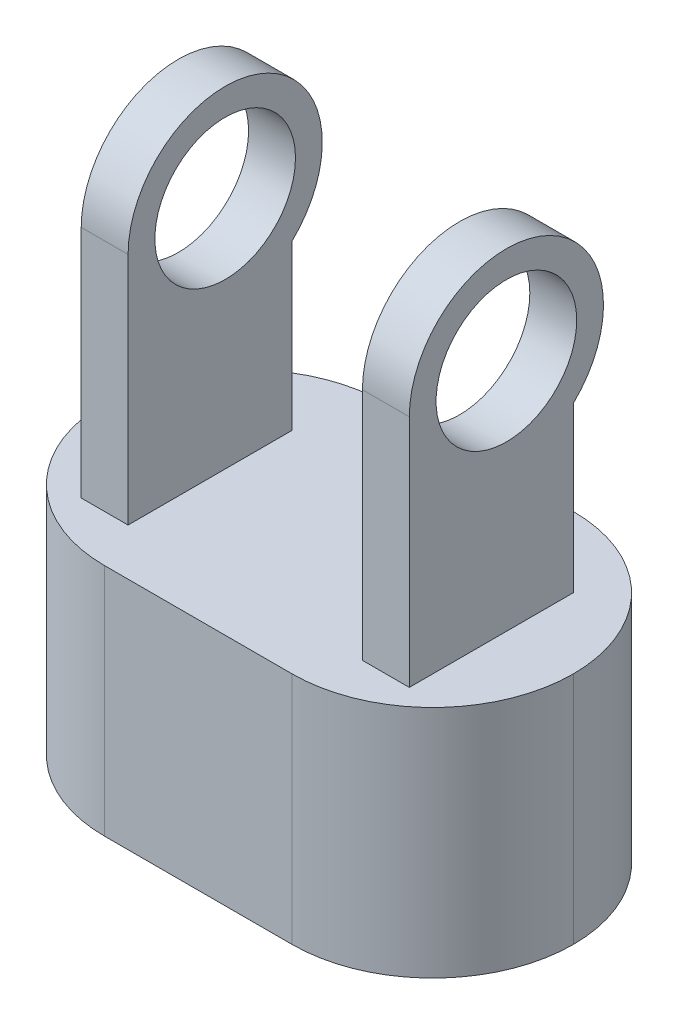
ISO-10303-21;
HEADER;
FILE_DESCRIPTION(('STEP AP214'),'2;1');
FILE_NAME('part.step','',(''),(''),'','','');
FILE_SCHEMA(('AUTOMOTIVE_DESIGN { 1 0 10303 214 1 1 1 1 }'));
ENDSEC;
DATA;
#1=APPLICATION_CONTEXT('core data for automotive mechanical design processes');
#2=APPLICATION_PROTOCOL_DEFINITION('international standard','automotive_design',2000,#1);
#3=PRODUCT_CONTEXT('',#1,'mechanical');
#4=PRODUCT('Part','Part','',(#3));
#5=PRODUCT_RELATED_PRODUCT_CATEGORY('part','',(#4));
#6=PRODUCT_DEFINITION_FORMATION('','',#4);
#7=PRODUCT_DEFINITION_CONTEXT('part definition',#1,'design');
#8=PRODUCT_DEFINITION('design','',#6,#7);
#9=PRODUCT_DEFINITION_SHAPE('','',#8);
#10=(LENGTH_UNIT() NAMED_UNIT(*) SI_UNIT(.MILLI.,.METRE.));
#11=(NAMED_UNIT(*) PLANE_ANGLE_UNIT() SI_UNIT($,.RADIAN.));
#12=(NAMED_UNIT(*) SI_UNIT($,.STERADIAN.) SOLID_ANGLE_UNIT());
#13=UNCERTAINTY_MEASURE_WITH_UNIT(LENGTH_MEASURE(1.E-05),#10,'distance_accuracy_value','');
#14=(GEOMETRIC_REPRESENTATION_CONTEXT(3) GLOBAL_UNCERTAINTY_ASSIGNED_CONTEXT((#13)) GLOBAL_UNIT_ASSIGNED_CONTEXT((#10,
#11,#12)) REPRESENTATION_CONTEXT('',''));
#15=CARTESIAN_POINT('',(0.,0.,0.));
#16=DIRECTION('',(0.,0.,1.));
#17=DIRECTION('',(1.,0.,0.));
#18=AXIS2_PLACEMENT_3D('',#15,#16,#17);
#19=CARTESIAN_POINT('',(-10.,10.,0.));
#20=DIRECTION('',(0.,0.,-1.));
#21=DIRECTION('',(-1.,0.,0.));
#22=AXIS2_PLACEMENT_3D('',#19,#20,#21);
#23=PLANE('',#22);
#24=DIRECTION('',(1.,0.,0.));
#25=VECTOR('',#24,1.);
#26=CARTESIAN_POINT('',(-10.,0.,0.));
#27=LINE('',#26,#25);
#28=CARTESIAN_POINT('',(-4.,0.,0.));
#29=VERTEX_POINT('',#28);
#30=CARTESIAN_POINT('',(4.,0.,0.));
#31=VERTEX_POINT('',#30);
#32=EDGE_CURVE('E281',#29,#31,#27,.T.);
#33=ORIENTED_EDGE('',*,*,#32,.T.);
#34=DIRECTION('',(0.,-1.,0.));
#35=VECTOR('',#34,1.);
#36=CARTESIAN_POINT('',(4.,10.,0.));
#37=LINE('',#36,#35);
#38=CARTESIAN_POINT('',(4.,10.,0.));
#39=VERTEX_POINT('',#38);
#40=EDGE_CURVE('E12',#31,#39,#37,.F.);
#41=ORIENTED_EDGE('',*,*,#40,.T.);
#42=DIRECTION('',(1.,0.,0.));
#43=VECTOR('',#42,1.);
#44=CARTESIAN_POINT('',(-10.,10.,0.));
#45=LINE('',#44,#43);
#46=CARTESIAN_POINT('',(-4.,10.,0.));
#47=VERTEX_POINT('',#46);
#48=EDGE_CURVE('E282',#47,#39,#45,.T.);
#49=ORIENTED_EDGE('',*,*,#48,.F.);
#50=DIRECTION('',(0.,-1.,0.));
#51=VECTOR('',#50,1.);
#52=CARTESIAN_POINT('',(-4.,10.,0.));
#53=LINE('',#52,#51);
#54=EDGE_CURVE('E83',#47,#29,#53,.T.);
#55=ORIENTED_EDGE('',*,*,#54,.T.);
#56=EDGE_LOOP('',(#33,#41,#49,#55));
#57=FACE_BOUND('',#56,.T.);
#58=ADVANCED_FACE('F73',(#57),#23,.F.);
#59=CARTESIAN_POINT('',(10.,10.,-12.));
#60=DIRECTION('',(0.,0.,1.));
#61=DIRECTION('',(1.,0.,0.));
#62=AXIS2_PLACEMENT_3D('',#59,#60,#61);
#63=PLANE('',#62);
#64=DIRECTION('',(-1.,0.,0.));
#65=VECTOR('',#64,1.);
#66=CARTESIAN_POINT('',(10.,0.,-12.));
#67=LINE('',#66,#65);
#68=CARTESIAN_POINT('',(4.,0.,-12.));
#69=VERTEX_POINT('',#68);
#70=CARTESIAN_POINT('',(-4.,0.,-12.));
#71=VERTEX_POINT('',#70);
#72=EDGE_CURVE('E286',#69,#71,#67,.T.);
#73=ORIENTED_EDGE('',*,*,#72,.T.);
#74=DIRECTION('',(0.,-1.,0.));
#75=VECTOR('',#74,1.);
#76=CARTESIAN_POINT('',(-4.,10.,-12.));
#77=LINE('',#76,#75);
#78=CARTESIAN_POINT('',(-4.,10.,-12.));
#79=VERTEX_POINT('',#78);
#80=EDGE_CURVE('E311',#71,#79,#77,.F.);
#81=ORIENTED_EDGE('',*,*,#80,.T.);
#82=DIRECTION('',(-1.,0.,0.));
#83=VECTOR('',#82,1.);
#84=CARTESIAN_POINT('',(10.,10.,-12.));
#85=LINE('',#84,#83);
#86=CARTESIAN_POINT('',(4.,10.,-12.));
#87=VERTEX_POINT('',#86);
#88=EDGE_CURVE('E285',#87,#79,#85,.T.);
#89=ORIENTED_EDGE('',*,*,#88,.F.);
#90=DIRECTION('',(0.,-1.,0.));
#91=VECTOR('',#90,1.);
#92=CARTESIAN_POINT('',(4.,10.,-12.));
#93=LINE('',#92,#91);
#94=EDGE_CURVE('E307',#87,#69,#93,.T.);
#95=ORIENTED_EDGE('',*,*,#94,.T.);
#96=EDGE_LOOP('',(#73,#81,#89,#95));
#97=FACE_BOUND('',#96,.T.);
#98=ADVANCED_FACE('F356',(#97),#63,.F.);
#99=CARTESIAN_POINT('',(0.,10.,0.));
#100=DIRECTION('',(0.,1.,0.));
#101=DIRECTION('',(0.,0.,1.));
#102=AXIS2_PLACEMENT_3D('',#99,#100,#101);
#103=PLANE('',#102);
#104=DIRECTION('',(-1.,0.,0.));
#105=VECTOR('',#104,1.);
#106=CARTESIAN_POINT('',(7.,10.,-9.));
#107=LINE('',#106,#105);
#108=CARTESIAN_POINT('',(7.,10.,-9.));
#109=VERTEX_POINT('',#108);
#110=CARTESIAN_POINT('',(5.,10.,-9.));
#111=VERTEX_POINT('',#110);
#112=EDGE_CURVE('E189',#109,#111,#107,.T.);
#113=ORIENTED_EDGE('',*,*,#112,.F.);
#114=DIRECTION('',(0.,0.,1.));
#115=VECTOR('',#114,1.);
#116=CARTESIAN_POINT('',(7.,10.,-9.));
#117=LINE('',#116,#115);
#118=CARTESIAN_POINT('',(7.,10.,-2.));
#119=VERTEX_POINT('',#118);
#120=EDGE_CURVE('E200',#109,#119,#117,.T.);
#121=ORIENTED_EDGE('',*,*,#120,.T.);
#122=DIRECTION('',(-1.,0.,0.));
#123=VECTOR('',#122,1.);
#124=CARTESIAN_POINT('',(7.,10.,-2.));
#125=LINE('',#124,#123);
#126=CARTESIAN_POINT('',(5.,10.,-2.));
#127=VERTEX_POINT('',#126);
#128=EDGE_CURVE('E208',#119,#127,#125,.T.);
#129=ORIENTED_EDGE('',*,*,#128,.T.);
#130=DIRECTION('',(0.,0.,1.));
#131=VECTOR('',#130,1.);
#132=CARTESIAN_POINT('',(5.,10.,-9.));
#133=LINE('',#132,#131);
#134=EDGE_CURVE('E212',#111,#127,#133,.T.);
#135=ORIENTED_EDGE('',*,*,#134,.F.);
#136=EDGE_LOOP('',(#113,#121,#129,#135));
#137=FACE_BOUND('',#136,.T.);
#138=DIRECTION('',(0.,0.,1.));
#139=VECTOR('',#138,1.);
#140=CARTESIAN_POINT('',(-7.,10.,-9.));
#141=LINE('',#140,#139);
#142=CARTESIAN_POINT('',(-7.,10.,-9.));
#143=VERTEX_POINT('',#142);
#144=CARTESIAN_POINT('',(-7.,10.,-2.));
#145=VERTEX_POINT('',#144);
#146=EDGE_CURVE('E241',#143,#145,#141,.T.);
#147=ORIENTED_EDGE('',*,*,#146,.F.);
#148=DIRECTION('',(1.,0.,0.));
#149=VECTOR('',#148,1.);
#150=CARTESIAN_POINT('',(-7.,10.,-9.));
#151=LINE('',#150,#149);
#152=CARTESIAN_POINT('',(-5.,10.,-9.));
#153=VERTEX_POINT('',#152);
#154=EDGE_CURVE('E255',#143,#153,#151,.T.);
#155=ORIENTED_EDGE('',*,*,#154,.T.);
#156=DIRECTION('',(0.,0.,1.));
#157=VECTOR('',#156,1.);
#158=CARTESIAN_POINT('',(-5.,10.,-9.));
#159=LINE('',#158,#157);
#160=CARTESIAN_POINT('',(-5.,10.,-2.));
#161=VERTEX_POINT('',#160);
#162=EDGE_CURVE('E237',#153,#161,#159,.T.);
#163=ORIENTED_EDGE('',*,*,#162,.T.);
#164=DIRECTION('',(1.,0.,0.));
#165=VECTOR('',#164,1.);
#166=CARTESIAN_POINT('',(-7.,10.,-2.));
#167=LINE('',#166,#165);
#168=EDGE_CURVE('E278',#145,#161,#167,.T.);
#169=ORIENTED_EDGE('',*,*,#168,.F.);
#170=EDGE_LOOP('',(#147,#155,#163,#169));
#171=FACE_BOUND('',#170,.T.);
#172=CARTESIAN_POINT('',(4.,10.,-6.));
#173=DIRECTION('',(0.,1.,0.));
#174=DIRECTION('',(0.,0.,1.));
#175=AXIS2_PLACEMENT_3D('',#172,#173,#174);
#176=CIRCLE('',#175,6.);
#177=CARTESIAN_POINT('',(10.,10.,-6.));
#178=VERTEX_POINT('',#177);
#179=EDGE_CURVE('E91',#39,#178,#176,.T.);
#180=ORIENTED_EDGE('',*,*,#179,.T.);
#181=CARTESIAN_POINT('',(4.,10.,-6.));
#182=DIRECTION('',(0.,1.,0.));
#183=DIRECTION('',(0.,0.,1.));
#184=AXIS2_PLACEMENT_3D('',#181,#182,#183);
#185=CIRCLE('',#184,6.);
#186=EDGE_CURVE('E323',#178,#87,#185,.T.);
#187=ORIENTED_EDGE('',*,*,#186,.T.);
#188=ORIENTED_EDGE('',*,*,#88,.T.);
#189=CARTESIAN_POINT('',(-4.,10.,-6.));
#190=DIRECTION('',(0.,1.,0.));
#191=DIRECTION('',(0.,0.,1.));
#192=AXIS2_PLACEMENT_3D('',#189,#190,#191);
#193=CIRCLE('',#192,6.);
#194=CARTESIAN_POINT('',(-10.,10.,-6.));
#195=VERTEX_POINT('',#194);
#196=EDGE_CURVE('E318',#79,#195,#193,.T.);
#197=ORIENTED_EDGE('',*,*,#196,.T.);
#198=CARTESIAN_POINT('',(-4.,10.,-6.));
#199=DIRECTION('',(0.,1.,0.));
#200=DIRECTION('',(0.,0.,1.));
#201=AXIS2_PLACEMENT_3D('',#198,#199,#200);
#202=CIRCLE('',#201,6.);
#203=EDGE_CURVE('E315',#195,#47,#202,.T.);
#204=ORIENTED_EDGE('',*,*,#203,.T.);
#205=ORIENTED_EDGE('',*,*,#48,.T.);
#206=EDGE_LOOP('',(#180,#187,#188,#197,#204,#205));
#207=FACE_BOUND('',#206,.T.);
#208=ADVANCED_FACE('F359',(#137,#171,#207),#103,.T.);
#209=CARTESIAN_POINT('',(0.,0.,0.));
#210=DIRECTION('',(0.,1.,0.));
#211=DIRECTION('',(0.,0.,1.));
#212=AXIS2_PLACEMENT_3D('',#209,#210,#211);
#213=PLANE('',#212);
#214=ORIENTED_EDGE('',*,*,#72,.F.);
#215=CARTESIAN_POINT('',(4.,0.,-6.));
#216=DIRECTION('',(0.,1.,0.));
#217=DIRECTION('',(0.,0.,1.));
#218=AXIS2_PLACEMENT_3D('',#215,#216,#217);
#219=CIRCLE('',#218,6.);
#220=CARTESIAN_POINT('',(10.,0.,-6.));
#221=VERTEX_POINT('',#220);
#222=EDGE_CURVE('E304',#69,#221,#219,.F.);
#223=ORIENTED_EDGE('',*,*,#222,.T.);
#224=CARTESIAN_POINT('',(4.,0.,-6.));
#225=DIRECTION('',(0.,1.,0.));
#226=DIRECTION('',(0.,0.,1.));
#227=AXIS2_PLACEMENT_3D('',#224,#225,#226);
#228=CIRCLE('',#227,6.);
#229=EDGE_CURVE('E301',#221,#31,#228,.F.);
#230=ORIENTED_EDGE('',*,*,#229,.T.);
#231=ORIENTED_EDGE('',*,*,#32,.F.);
#232=CARTESIAN_POINT('',(-4.,0.,-6.));
#233=DIRECTION('',(0.,1.,0.));
#234=DIRECTION('',(0.,0.,1.));
#235=AXIS2_PLACEMENT_3D('',#232,#233,#234);
#236=CIRCLE('',#235,6.);
#237=CARTESIAN_POINT('',(-10.,0.,-6.));
#238=VERTEX_POINT('',#237);
#239=EDGE_CURVE('E290',#29,#238,#236,.F.);
#240=ORIENTED_EDGE('',*,*,#239,.T.);
#241=CARTESIAN_POINT('',(-4.,0.,-6.));
#242=DIRECTION('',(0.,1.,0.));
#243=DIRECTION('',(0.,0.,1.));
#244=AXIS2_PLACEMENT_3D('',#241,#242,#243);
#245=CIRCLE('',#244,6.);
#246=EDGE_CURVE('E298',#238,#71,#245,.F.);
#247=ORIENTED_EDGE('',*,*,#246,.T.);
#248=EDGE_LOOP('',(#214,#223,#230,#231,#240,#247));
#249=FACE_BOUND('',#248,.T.);
#250=ADVANCED_FACE('F348',(#249),#213,.F.);
#251=CARTESIAN_POINT('',(-7.,10.,-2.));
#252=DIRECTION('',(0.,0.,-1.));
#253=DIRECTION('',(-1.,0.,0.));
#254=AXIS2_PLACEMENT_3D('',#251,#252,#253);
#255=PLANE('',#254);
#256=DIRECTION('',(0.,1.,0.));
#257=VECTOR('',#256,1.);
#258=CARTESIAN_POINT('',(-5.,10.,-2.));
#259=LINE('',#258,#257);
#260=CARTESIAN_POINT('',(-5.,20.,-2.));
#261=VERTEX_POINT('',#260);
#262=EDGE_CURVE('E259',#161,#261,#259,.T.);
#263=ORIENTED_EDGE('',*,*,#262,.T.);
#264=DIRECTION('',(1.,0.,0.));
#265=VECTOR('',#264,1.);
#266=CARTESIAN_POINT('',(-7.,20.,-2.));
#267=LINE('',#266,#265);
#268=CARTESIAN_POINT('',(-7.,20.,-2.));
#269=VERTEX_POINT('',#268);
#270=EDGE_CURVE('E274',#269,#261,#267,.T.);
#271=ORIENTED_EDGE('',*,*,#270,.F.);
#272=DIRECTION('',(0.,1.,0.));
#273=VECTOR('',#272,1.);
#274=CARTESIAN_POINT('',(-7.,10.,-2.));
#275=LINE('',#274,#273);
#276=EDGE_CURVE('E245',#145,#269,#275,.T.);
#277=ORIENTED_EDGE('',*,*,#276,.F.);
#278=ORIENTED_EDGE('',*,*,#168,.T.);
#279=EDGE_LOOP('',(#263,#271,#277,#278));
#280=FACE_BOUND('',#279,.T.);
#281=ADVANCED_FACE('F367',(#280),#255,.F.);
#282=CARTESIAN_POINT('',(-7.,20.,-6.14285714285714));
#283=DIRECTION('',(1.,0.,0.));
#284=DIRECTION('',(0.,0.,-1.));
#285=AXIS2_PLACEMENT_3D('',#282,#283,#284);
#286=CYLINDRICAL_SURFACE('',#285,4.14285714285714);
#287=CARTESIAN_POINT('',(-5.,20.,-6.14285714285714));
#288=DIRECTION('',(-1.,0.,0.));
#289=DIRECTION('',(0.,0.,1.));
#290=AXIS2_PLACEMENT_3D('',#287,#288,#289);
#291=CIRCLE('',#290,4.14285714285714);
#292=CARTESIAN_POINT('',(-5.,17.,-9.));
#293=VERTEX_POINT('',#292);
#294=EDGE_CURVE('E262',#261,#293,#291,.T.);
#295=ORIENTED_EDGE('',*,*,#294,.T.);
#296=DIRECTION('',(1.,0.,0.));
#297=VECTOR('',#296,1.);
#298=CARTESIAN_POINT('',(-7.,17.,-9.));
#299=LINE('',#298,#297);
#300=CARTESIAN_POINT('',(-7.,17.,-9.));
#301=VERTEX_POINT('',#300);
#302=EDGE_CURVE('E270',#301,#293,#299,.T.);
#303=ORIENTED_EDGE('',*,*,#302,.F.);
#304=CARTESIAN_POINT('',(-7.,20.,-6.14285714285714));
#305=DIRECTION('',(-1.,0.,0.));
#306=DIRECTION('',(0.,0.,1.));
#307=AXIS2_PLACEMENT_3D('',#304,#305,#306);
#308=CIRCLE('',#307,4.14285714285714);
#309=EDGE_CURVE('E249',#269,#301,#308,.T.);
#310=ORIENTED_EDGE('',*,*,#309,.F.);
#311=ORIENTED_EDGE('',*,*,#270,.T.);
#312=EDGE_LOOP('',(#295,#303,#310,#311));
#313=FACE_BOUND('',#312,.T.);
#314=ADVANCED_FACE('F468',(#313),#286,.T.);
#315=CARTESIAN_POINT('',(-7.,17.,-9.));
#316=DIRECTION('',(0.,0.,1.));
#317=DIRECTION('',(1.,0.,0.));
#318=AXIS2_PLACEMENT_3D('',#315,#316,#317);
#319=PLANE('',#318);
#320=DIRECTION('',(0.,-1.,0.));
#321=VECTOR('',#320,1.);
#322=CARTESIAN_POINT('',(-5.,17.,-9.));
#323=LINE('',#322,#321);
#324=EDGE_CURVE('E246',#293,#153,#323,.T.);
#325=ORIENTED_EDGE('',*,*,#324,.T.);
#326=ORIENTED_EDGE('',*,*,#154,.F.);
#327=DIRECTION('',(0.,-1.,0.));
#328=VECTOR('',#327,1.);
#329=CARTESIAN_POINT('',(-7.,17.,-9.));
#330=LINE('',#329,#328);
#331=EDGE_CURVE('E252',#301,#143,#330,.T.);
#332=ORIENTED_EDGE('',*,*,#331,.F.);
#333=ORIENTED_EDGE('',*,*,#302,.T.);
#334=EDGE_LOOP('',(#325,#326,#332,#333));
#335=FACE_BOUND('',#334,.T.);
#336=ADVANCED_FACE('F460',(#335),#319,.F.);
#337=CARTESIAN_POINT('',(-7.,20.,-6.14285714285714));
#338=DIRECTION('',(-1.,0.,0.));
#339=DIRECTION('',(0.,0.,1.));
#340=AXIS2_PLACEMENT_3D('',#337,#338,#339);
#341=PLANE('',#340);
#342=CARTESIAN_POINT('',(-7.,20.,-6.14285714285714));
#343=DIRECTION('',(1.,0.,0.));
#344=DIRECTION('',(0.,0.,-1.));
#345=AXIS2_PLACEMENT_3D('',#342,#343,#344);
#346=CIRCLE('',#345,3.);
#347=CARTESIAN_POINT('',(-7.,20.,-9.14285714285714));
#348=VERTEX_POINT('',#347);
#349=EDGE_CURVE('E233',#348,#348,#346,.T.);
#350=ORIENTED_EDGE('',*,*,#349,.T.);
#351=EDGE_LOOP('',(#350));
#352=FACE_BOUND('',#351,.T.);
#353=ORIENTED_EDGE('',*,*,#146,.T.);
#354=ORIENTED_EDGE('',*,*,#276,.T.);
#355=ORIENTED_EDGE('',*,*,#309,.T.);
#356=ORIENTED_EDGE('',*,*,#331,.T.);
#357=EDGE_LOOP('',(#353,#354,#355,#356));
#358=FACE_BOUND('',#357,.T.);
#359=ADVANCED_FACE('F452',(#352,#358),#341,.T.);
#360=CARTESIAN_POINT('',(-5.,20.,-6.14285714285714));
#361=DIRECTION('',(-1.,0.,0.));
#362=DIRECTION('',(0.,0.,1.));
#363=AXIS2_PLACEMENT_3D('',#360,#361,#362);
#364=PLANE('',#363);
#365=CARTESIAN_POINT('',(-5.,20.,-6.14285714285714));
#366=DIRECTION('',(1.,0.,0.));
#367=DIRECTION('',(0.,0.,-1.));
#368=AXIS2_PLACEMENT_3D('',#365,#366,#367);
#369=CIRCLE('',#368,3.);
#370=CARTESIAN_POINT('',(-5.,20.,-9.14285714285714));
#371=VERTEX_POINT('',#370);
#372=EDGE_CURVE('E232',#371,#371,#369,.T.);
#373=ORIENTED_EDGE('',*,*,#372,.F.);
#374=EDGE_LOOP('',(#373));
#375=FACE_BOUND('',#374,.T.);
#376=ORIENTED_EDGE('',*,*,#162,.F.);
#377=ORIENTED_EDGE('',*,*,#324,.F.);
#378=ORIENTED_EDGE('',*,*,#294,.F.);
#379=ORIENTED_EDGE('',*,*,#262,.F.);
#380=EDGE_LOOP('',(#376,#377,#378,#379));
#381=FACE_BOUND('',#380,.T.);
#382=ADVANCED_FACE('F444',(#375,#381),#364,.F.);
#383=CARTESIAN_POINT('',(-7.,20.,-6.14285714285714));
#384=DIRECTION('',(1.,0.,0.));
#385=DIRECTION('',(0.,0.,-1.));
#386=AXIS2_PLACEMENT_3D('',#383,#384,#385);
#387=CYLINDRICAL_SURFACE('',#386,3.);
#388=ORIENTED_EDGE('',*,*,#349,.F.);
#389=EDGE_LOOP('',(#388));
#390=FACE_BOUND('',#389,.T.);
#391=ORIENTED_EDGE('',*,*,#372,.T.);
#392=EDGE_LOOP('',(#391));
#393=FACE_BOUND('',#392,.T.);
#394=ADVANCED_FACE('F437',(#390,#393),#387,.F.);
#395=CARTESIAN_POINT('',(7.,20.,-6.14285714285714));
#396=DIRECTION('',(1.,0.,0.));
#397=DIRECTION('',(0.,0.,1.));
#398=AXIS2_PLACEMENT_3D('',#395,#396,#397);
#399=PLANE('',#398);
#400=ORIENTED_EDGE('',*,*,#120,.F.);
#401=DIRECTION('',(0.,-1.,0.));
#402=VECTOR('',#401,1.);
#403=CARTESIAN_POINT('',(7.,17.,-9.));
#404=LINE('',#403,#402);
#405=CARTESIAN_POINT('',(7.,17.,-9.));
#406=VERTEX_POINT('',#405);
#407=EDGE_CURVE('E181',#406,#109,#404,.T.);
#408=ORIENTED_EDGE('',*,*,#407,.F.);
#409=CARTESIAN_POINT('',(7.,20.,-6.14285714285714));
#410=DIRECTION('',(-1.,0.,0.));
#411=DIRECTION('',(0.,0.,1.));
#412=AXIS2_PLACEMENT_3D('',#409,#410,#411);
#413=CIRCLE('',#412,4.14285714285714);
#414=CARTESIAN_POINT('',(7.,20.,-2.));
#415=VERTEX_POINT('',#414);
#416=EDGE_CURVE('E198',#415,#406,#413,.T.);
#417=ORIENTED_EDGE('',*,*,#416,.F.);
#418=DIRECTION('',(0.,1.,0.));
#419=VECTOR('',#418,1.);
#420=CARTESIAN_POINT('',(7.,10.,-2.));
#421=LINE('',#420,#419);
#422=EDGE_CURVE('E205',#119,#415,#421,.T.);
#423=ORIENTED_EDGE('',*,*,#422,.F.);
#424=EDGE_LOOP('',(#400,#408,#417,#423));
#425=FACE_BOUND('',#424,.T.);
#426=CARTESIAN_POINT('',(7.,20.,-6.14285714285714));
#427=DIRECTION('',(1.,0.,0.));
#428=DIRECTION('',(0.,0.,-1.));
#429=AXIS2_PLACEMENT_3D('',#426,#427,#428);
#430=CIRCLE('',#429,3.);
#431=CARTESIAN_POINT('',(7.,20.,-9.14285714285714));
#432=VERTEX_POINT('',#431);
#433=EDGE_CURVE('E216',#432,#432,#430,.T.);
#434=ORIENTED_EDGE('',*,*,#433,.F.);
#435=EDGE_LOOP('',(#434));
#436=FACE_BOUND('',#435,.T.);
#437=ADVANCED_FACE('F195',(#425,#436),#399,.T.);
#438=CARTESIAN_POINT('',(5.,20.,-6.14285714285714));
#439=DIRECTION('',(1.,0.,0.));
#440=DIRECTION('',(0.,0.,1.));
#441=AXIS2_PLACEMENT_3D('',#438,#439,#440);
#442=PLANE('',#441);
#443=ORIENTED_EDGE('',*,*,#134,.T.);
#444=DIRECTION('',(0.,1.,0.));
#445=VECTOR('',#444,1.);
#446=CARTESIAN_POINT('',(5.,10.,-2.));
#447=LINE('',#446,#445);
#448=CARTESIAN_POINT('',(5.,20.,-2.));
#449=VERTEX_POINT('',#448);
#450=EDGE_CURVE('E222',#127,#449,#447,.T.);
#451=ORIENTED_EDGE('',*,*,#450,.T.);
#452=CARTESIAN_POINT('',(5.,20.,-6.14285714285714));
#453=DIRECTION('',(-1.,0.,0.));
#454=DIRECTION('',(0.,0.,1.));
#455=AXIS2_PLACEMENT_3D('',#452,#453,#454);
#456=CIRCLE('',#455,4.14285714285714);
#457=CARTESIAN_POINT('',(5.,17.,-9.));
#458=VERTEX_POINT('',#457);
#459=EDGE_CURVE('E219',#449,#458,#456,.T.);
#460=ORIENTED_EDGE('',*,*,#459,.T.);
#461=DIRECTION('',(0.,-1.,0.));
#462=VECTOR('',#461,1.);
#463=CARTESIAN_POINT('',(5.,17.,-9.));
#464=LINE('',#463,#462);
#465=EDGE_CURVE('E183',#458,#111,#464,.T.);
#466=ORIENTED_EDGE('',*,*,#465,.T.);
#467=EDGE_LOOP('',(#443,#451,#460,#466));
#468=FACE_BOUND('',#467,.T.);
#469=CARTESIAN_POINT('',(5.,20.,-6.14285714285714));
#470=DIRECTION('',(1.,0.,0.));
#471=DIRECTION('',(0.,0.,-1.));
#472=AXIS2_PLACEMENT_3D('',#469,#470,#471);
#473=CIRCLE('',#472,3.);
#474=CARTESIAN_POINT('',(5.,20.,-9.14285714285714));
#475=VERTEX_POINT('',#474);
#476=EDGE_CURVE('E330',#475,#475,#473,.T.);
#477=ORIENTED_EDGE('',*,*,#476,.T.);
#478=EDGE_LOOP('',(#477));
#479=FACE_BOUND('',#478,.T.);
#480=ADVANCED_FACE('F423',(#468,#479),#442,.F.);
#481=CARTESIAN_POINT('',(7.,17.,-9.));
#482=DIRECTION('',(0.,0.,-1.));
#483=DIRECTION('',(-1.,0.,0.));
#484=AXIS2_PLACEMENT_3D('',#481,#482,#483);
#485=PLANE('',#484);
#486=ORIENTED_EDGE('',*,*,#465,.F.);
#487=DIRECTION('',(-1.,0.,0.));
#488=VECTOR('',#487,1.);
#489=CARTESIAN_POINT('',(7.,17.,-9.));
#490=LINE('',#489,#488);
#491=EDGE_CURVE('E177',#406,#458,#490,.T.);
#492=ORIENTED_EDGE('',*,*,#491,.F.);
#493=ORIENTED_EDGE('',*,*,#407,.T.);
#494=ORIENTED_EDGE('',*,*,#112,.T.);
#495=EDGE_LOOP('',(#486,#492,#493,#494));
#496=FACE_BOUND('',#495,.T.);
#497=ADVANCED_FACE('F179',(#496),#485,.T.);
#498=CARTESIAN_POINT('',(7.,20.,-6.14285714285714));
#499=DIRECTION('',(-1.,0.,0.));
#500=DIRECTION('',(0.,0.,1.));
#501=AXIS2_PLACEMENT_3D('',#498,#499,#500);
#502=CYLINDRICAL_SURFACE('',#501,4.14285714285714);
#503=ORIENTED_EDGE('',*,*,#459,.F.);
#504=DIRECTION('',(-1.,0.,0.));
#505=VECTOR('',#504,1.);
#506=CARTESIAN_POINT('',(7.,20.,-2.));
#507=LINE('',#506,#505);
#508=EDGE_CURVE('E190',#415,#449,#507,.T.);
#509=ORIENTED_EDGE('',*,*,#508,.F.);
#510=ORIENTED_EDGE('',*,*,#416,.T.);
#511=ORIENTED_EDGE('',*,*,#491,.T.);
#512=EDGE_LOOP('',(#503,#509,#510,#511));
#513=FACE_BOUND('',#512,.T.);
#514=ADVANCED_FACE('F203',(#513),#502,.T.);
#515=CARTESIAN_POINT('',(7.,10.,-2.));
#516=DIRECTION('',(0.,0.,1.));
#517=DIRECTION('',(1.,0.,0.));
#518=AXIS2_PLACEMENT_3D('',#515,#516,#517);
#519=PLANE('',#518);
#520=ORIENTED_EDGE('',*,*,#450,.F.);
#521=ORIENTED_EDGE('',*,*,#128,.F.);
#522=ORIENTED_EDGE('',*,*,#422,.T.);
#523=ORIENTED_EDGE('',*,*,#508,.T.);
#524=EDGE_LOOP('',(#520,#521,#522,#523));
#525=FACE_BOUND('',#524,.T.);
#526=ADVANCED_FACE('F402',(#525),#519,.T.);
#527=CARTESIAN_POINT('',(7.,20.,-6.14285714285714));
#528=DIRECTION('',(-1.,0.,0.));
#529=DIRECTION('',(0.,0.,1.));
#530=AXIS2_PLACEMENT_3D('',#527,#528,#529);
#531=CYLINDRICAL_SURFACE('',#530,3.);
#532=ORIENTED_EDGE('',*,*,#433,.T.);
#533=EDGE_LOOP('',(#532));
#534=FACE_BOUND('',#533,.T.);
#535=ORIENTED_EDGE('',*,*,#476,.F.);
#536=EDGE_LOOP('',(#535));
#537=FACE_BOUND('',#536,.T.);
#538=ADVANCED_FACE('F380',(#534,#537),#531,.F.);
#539=CARTESIAN_POINT('',(-4.,10.,-6.));
#540=DIRECTION('',(0.,-1.,0.));
#541=DIRECTION('',(0.,0.,-1.));
#542=AXIS2_PLACEMENT_3D('',#539,#540,#541);
#543=CYLINDRICAL_SURFACE('',#542,6.);
#544=ORIENTED_EDGE('',*,*,#54,.F.);
#545=ORIENTED_EDGE('',*,*,#203,.F.);
#546=DIRECTION('',(0.,-1.,0.));
#547=VECTOR('',#546,1.);
#548=CARTESIAN_POINT('',(-10.,10.,-6.));
#549=LINE('',#548,#547);
#550=EDGE_CURVE('E327',#238,#195,#549,.F.);
#551=ORIENTED_EDGE('',*,*,#550,.F.);
#552=ORIENTED_EDGE('',*,*,#239,.F.);
#553=EDGE_LOOP('',(#544,#545,#551,#552));
#554=FACE_BOUND('',#553,.T.);
#555=ADVANCED_FACE('F353',(#554),#543,.T.);
#556=CARTESIAN_POINT('',(-4.,10.,-6.));
#557=DIRECTION('',(0.,-1.,0.));
#558=DIRECTION('',(0.,0.,-1.));
#559=AXIS2_PLACEMENT_3D('',#556,#557,#558);
#560=CYLINDRICAL_SURFACE('',#559,6.);
#561=ORIENTED_EDGE('',*,*,#196,.F.);
#562=ORIENTED_EDGE('',*,*,#80,.F.);
#563=ORIENTED_EDGE('',*,*,#246,.F.);
#564=ORIENTED_EDGE('',*,*,#550,.T.);
#565=EDGE_LOOP('',(#561,#562,#563,#564));
#566=FACE_BOUND('',#565,.T.);
#567=ADVANCED_FACE('F358',(#566),#560,.T.);
#568=CARTESIAN_POINT('',(4.,10.,-6.));
#569=DIRECTION('',(0.,-1.,0.));
#570=DIRECTION('',(0.,0.,-1.));
#571=AXIS2_PLACEMENT_3D('',#568,#569,#570);
#572=CYLINDRICAL_SURFACE('',#571,6.);
#573=DIRECTION('',(0.,-1.,0.));
#574=VECTOR('',#573,1.);
#575=CARTESIAN_POINT('',(10.,10.,-6.));
#576=LINE('',#575,#574);
#577=EDGE_CURVE('E77',#178,#221,#576,.T.);
#578=ORIENTED_EDGE('',*,*,#577,.F.);
#579=ORIENTED_EDGE('',*,*,#179,.F.);
#580=ORIENTED_EDGE('',*,*,#40,.F.);
#581=ORIENTED_EDGE('',*,*,#229,.F.);
#582=EDGE_LOOP('',(#578,#579,#580,#581));
#583=FACE_BOUND('',#582,.T.);
#584=ADVANCED_FACE('F75',(#583),#572,.T.);
#585=CARTESIAN_POINT('',(4.,10.,-6.));
#586=DIRECTION('',(0.,-1.,0.));
#587=DIRECTION('',(0.,0.,-1.));
#588=AXIS2_PLACEMENT_3D('',#585,#586,#587);
#589=CYLINDRICAL_SURFACE('',#588,6.);
#590=ORIENTED_EDGE('',*,*,#186,.F.);
#591=ORIENTED_EDGE('',*,*,#577,.T.);
#592=ORIENTED_EDGE('',*,*,#222,.F.);
#593=ORIENTED_EDGE('',*,*,#94,.F.);
#594=EDGE_LOOP('',(#590,#591,#592,#593));
#595=FACE_BOUND('',#594,.T.);
#596=ADVANCED_FACE('F341',(#595),#589,.T.);
#597=CLOSED_SHELL('',(#58,#98,#208,#250,#281,#314,#336,#359,#382,#394,#437,#480,#497,#514,#526,
#538,#555,#567,#584,#596));
#598=MANIFOLD_SOLID_BREP('B2',#597);
#599=ADVANCED_BREP_SHAPE_REPRESENTATION('',(#18,#598),#14);
#600=SHAPE_DEFINITION_REPRESENTATION(#9,#599);
ENDSEC;
END-ISO-10303-21;
